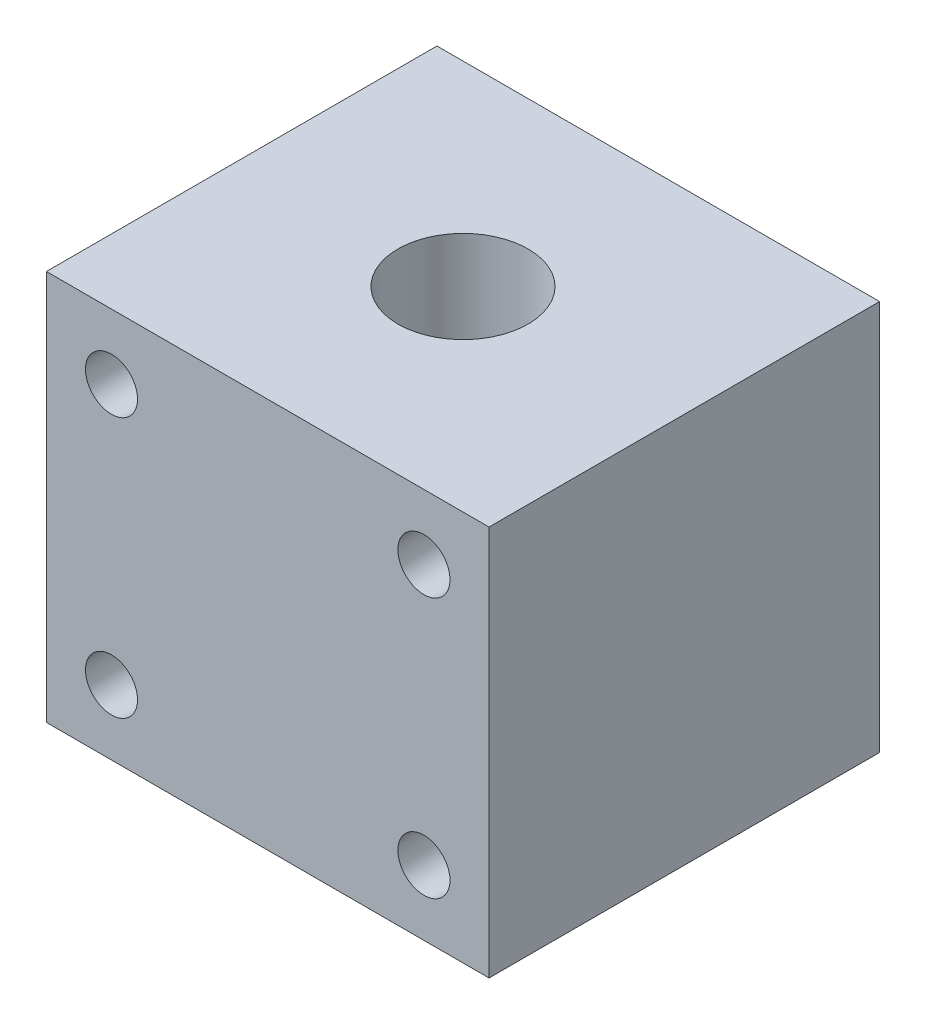
ISO-10303-21;
HEADER;
FILE_DESCRIPTION(('STEP AP214'),'2;1');
FILE_NAME('part.step','',(''),(''),'','','');
FILE_SCHEMA(('AUTOMOTIVE_DESIGN { 1 0 10303 214 1 1 1 1 }'));
ENDSEC;
DATA;
#1=APPLICATION_CONTEXT('core data for automotive mechanical design processes');
#2=APPLICATION_PROTOCOL_DEFINITION('international standard','automotive_design',2000,#1);
#3=PRODUCT_CONTEXT('',#1,'mechanical');
#4=PRODUCT('Part','Part','',(#3));
#5=PRODUCT_RELATED_PRODUCT_CATEGORY('part','',(#4));
#6=PRODUCT_DEFINITION_FORMATION('','',#4);
#7=PRODUCT_DEFINITION_CONTEXT('part definition',#1,'design');
#8=PRODUCT_DEFINITION('design','',#6,#7);
#9=PRODUCT_DEFINITION_SHAPE('','',#8);
#10=(LENGTH_UNIT() NAMED_UNIT(*) SI_UNIT(.MILLI.,.METRE.));
#11=(NAMED_UNIT(*) PLANE_ANGLE_UNIT() SI_UNIT($,.RADIAN.));
#12=(NAMED_UNIT(*) SI_UNIT($,.STERADIAN.) SOLID_ANGLE_UNIT());
#13=UNCERTAINTY_MEASURE_WITH_UNIT(LENGTH_MEASURE(1.E-05),#10,'distance_accuracy_value','');
#14=(GEOMETRIC_REPRESENTATION_CONTEXT(3) GLOBAL_UNCERTAINTY_ASSIGNED_CONTEXT((#13)) GLOBAL_UNIT_ASSIGNED_CONTEXT((#10,
#11,#12)) REPRESENTATION_CONTEXT('',''));
#15=CARTESIAN_POINT('',(0.,0.,0.));
#16=DIRECTION('',(0.,0.,1.));
#17=DIRECTION('',(1.,0.,0.));
#18=AXIS2_PLACEMENT_3D('',#15,#16,#17);
#19=CARTESIAN_POINT('',(0.,30.,0.));
#20=DIRECTION('',(0.,1.,0.));
#21=DIRECTION('',(0.,0.,1.));
#22=AXIS2_PLACEMENT_3D('',#19,#20,#21);
#23=PLANE('',#22);
#24=DIRECTION('',(0.,0.,1.));
#25=VECTOR('',#24,1.);
#26=CARTESIAN_POINT('',(0.,30.,0.));
#27=LINE('',#26,#25);
#28=CARTESIAN_POINT('',(0.,30.,0.));
#29=VERTEX_POINT('',#28);
#30=CARTESIAN_POINT('',(0.,30.,30.));
#31=VERTEX_POINT('',#30);
#32=EDGE_CURVE('E98',#29,#31,#27,.T.);
#33=ORIENTED_EDGE('',*,*,#32,.T.);
#34=DIRECTION('',(1.,0.,0.));
#35=VECTOR('',#34,1.);
#36=CARTESIAN_POINT('',(0.,30.,30.));
#37=LINE('',#36,#35);
#38=CARTESIAN_POINT('',(34.,30.,30.));
#39=VERTEX_POINT('',#38);
#40=EDGE_CURVE('E93',#31,#39,#37,.T.);
#41=ORIENTED_EDGE('',*,*,#40,.T.);
#42=DIRECTION('',(0.,0.,-1.));
#43=VECTOR('',#42,1.);
#44=CARTESIAN_POINT('',(34.,30.,0.));
#45=LINE('',#44,#43);
#46=CARTESIAN_POINT('',(34.,30.,0.));
#47=VERTEX_POINT('',#46);
#48=EDGE_CURVE('E96',#39,#47,#45,.T.);
#49=ORIENTED_EDGE('',*,*,#48,.T.);
#50=DIRECTION('',(-1.,0.,0.));
#51=VECTOR('',#50,1.);
#52=CARTESIAN_POINT('',(0.,30.,0.));
#53=LINE('',#52,#51);
#54=EDGE_CURVE('E63',#47,#29,#53,.T.);
#55=ORIENTED_EDGE('',*,*,#54,.T.);
#56=EDGE_LOOP('',(#33,#41,#49,#55));
#57=FACE_BOUND('',#56,.T.);
#58=CARTESIAN_POINT('',(17.,30.,15.));
#59=DIRECTION('',(0.,1.,0.));
#60=DIRECTION('',(0.,0.,1.));
#61=AXIS2_PLACEMENT_3D('',#58,#59,#60);
#62=CIRCLE('',#61,5.);
#63=CARTESIAN_POINT('',(17.,30.,20.));
#64=VERTEX_POINT('',#63);
#65=EDGE_CURVE('E114',#64,#64,#62,.T.);
#66=ORIENTED_EDGE('',*,*,#65,.F.);
#67=EDGE_LOOP('',(#66));
#68=FACE_BOUND('',#67,.T.);
#69=ADVANCED_FACE('F44',(#57,#68),#23,.T.);
#70=CARTESIAN_POINT('',(0.,0.,0.));
#71=DIRECTION('',(0.,1.,0.));
#72=DIRECTION('',(0.,0.,1.));
#73=AXIS2_PLACEMENT_3D('',#70,#71,#72);
#74=PLANE('',#73);
#75=DIRECTION('',(0.,0.,1.));
#76=VECTOR('',#75,1.);
#77=CARTESIAN_POINT('',(0.,0.,0.));
#78=LINE('',#77,#76);
#79=CARTESIAN_POINT('',(0.,0.,0.));
#80=VERTEX_POINT('',#79);
#81=CARTESIAN_POINT('',(0.,0.,30.));
#82=VERTEX_POINT('',#81);
#83=EDGE_CURVE('E111',#80,#82,#78,.T.);
#84=ORIENTED_EDGE('',*,*,#83,.F.);
#85=DIRECTION('',(-1.,0.,0.));
#86=VECTOR('',#85,1.);
#87=CARTESIAN_POINT('',(0.,0.,0.));
#88=LINE('',#87,#86);
#89=CARTESIAN_POINT('',(34.,0.,0.));
#90=VERTEX_POINT('',#89);
#91=EDGE_CURVE('E86',#90,#80,#88,.T.);
#92=ORIENTED_EDGE('',*,*,#91,.F.);
#93=DIRECTION('',(0.,0.,-1.));
#94=VECTOR('',#93,1.);
#95=CARTESIAN_POINT('',(34.,0.,0.));
#96=LINE('',#95,#94);
#97=CARTESIAN_POINT('',(34.,0.,30.));
#98=VERTEX_POINT('',#97);
#99=EDGE_CURVE('E80',#98,#90,#96,.T.);
#100=ORIENTED_EDGE('',*,*,#99,.F.);
#101=DIRECTION('',(1.,0.,0.));
#102=VECTOR('',#101,1.);
#103=CARTESIAN_POINT('',(0.,0.,30.));
#104=LINE('',#103,#102);
#105=EDGE_CURVE('E102',#82,#98,#104,.T.);
#106=ORIENTED_EDGE('',*,*,#105,.F.);
#107=EDGE_LOOP('',(#84,#92,#100,#106));
#108=FACE_BOUND('',#107,.T.);
#109=CARTESIAN_POINT('',(17.,0.,15.));
#110=DIRECTION('',(0.,1.,0.));
#111=DIRECTION('',(0.,0.,1.));
#112=AXIS2_PLACEMENT_3D('',#109,#110,#111);
#113=CIRCLE('',#112,5.);
#114=CARTESIAN_POINT('',(17.,0.,20.));
#115=VERTEX_POINT('',#114);
#116=EDGE_CURVE('E131',#115,#115,#113,.T.);
#117=ORIENTED_EDGE('',*,*,#116,.T.);
#118=EDGE_LOOP('',(#117));
#119=FACE_BOUND('',#118,.T.);
#120=ADVANCED_FACE('F181',(#108,#119),#74,.F.);
#121=CARTESIAN_POINT('',(0.,30.,0.));
#122=DIRECTION('',(1.,0.,0.));
#123=DIRECTION('',(0.,0.,-1.));
#124=AXIS2_PLACEMENT_3D('',#121,#122,#123);
#125=PLANE('',#124);
#126=ORIENTED_EDGE('',*,*,#83,.T.);
#127=DIRECTION('',(0.,-1.,0.));
#128=VECTOR('',#127,1.);
#129=CARTESIAN_POINT('',(0.,30.,30.));
#130=LINE('',#129,#128);
#131=EDGE_CURVE('E13',#31,#82,#130,.T.);
#132=ORIENTED_EDGE('',*,*,#131,.F.);
#133=ORIENTED_EDGE('',*,*,#32,.F.);
#134=DIRECTION('',(0.,-1.,0.));
#135=VECTOR('',#134,1.);
#136=CARTESIAN_POINT('',(0.,30.,0.));
#137=LINE('',#136,#135);
#138=EDGE_CURVE('E107',#29,#80,#137,.T.);
#139=ORIENTED_EDGE('',*,*,#138,.T.);
#140=EDGE_LOOP('',(#126,#132,#133,#139));
#141=FACE_BOUND('',#140,.T.);
#142=ADVANCED_FACE('F46',(#141),#125,.F.);
#143=CARTESIAN_POINT('',(0.,30.,30.));
#144=DIRECTION('',(0.,0.,-1.));
#145=DIRECTION('',(-1.,0.,0.));
#146=AXIS2_PLACEMENT_3D('',#143,#144,#145);
#147=PLANE('',#146);
#148=CARTESIAN_POINT('',(29.,5.,30.));
#149=DIRECTION('',(0.,0.,-1.));
#150=DIRECTION('',(1.,0.,0.));
#151=AXIS2_PLACEMENT_3D('',#148,#149,#150);
#152=CIRCLE('',#151,2.);
#153=CARTESIAN_POINT('',(31.,5.,30.));
#154=VERTEX_POINT('',#153);
#155=EDGE_CURVE('E144',#154,#154,#152,.T.);
#156=ORIENTED_EDGE('',*,*,#155,.T.);
#157=EDGE_LOOP('',(#156));
#158=FACE_BOUND('',#157,.T.);
#159=CARTESIAN_POINT('',(5.,5.,30.));
#160=DIRECTION('',(0.,0.,-1.));
#161=DIRECTION('',(-1.,0.,0.));
#162=AXIS2_PLACEMENT_3D('',#159,#160,#161);
#163=CIRCLE('',#162,2.);
#164=CARTESIAN_POINT('',(3.,5.,30.));
#165=VERTEX_POINT('',#164);
#166=EDGE_CURVE('E147',#165,#165,#163,.T.);
#167=ORIENTED_EDGE('',*,*,#166,.T.);
#168=EDGE_LOOP('',(#167));
#169=FACE_BOUND('',#168,.T.);
#170=CARTESIAN_POINT('',(5.,25.,30.));
#171=DIRECTION('',(0.,0.,-1.));
#172=DIRECTION('',(1.,0.,0.));
#173=AXIS2_PLACEMENT_3D('',#170,#171,#172);
#174=CIRCLE('',#173,2.);
#175=CARTESIAN_POINT('',(7.,25.,30.));
#176=VERTEX_POINT('',#175);
#177=EDGE_CURVE('E143',#176,#176,#174,.T.);
#178=ORIENTED_EDGE('',*,*,#177,.T.);
#179=EDGE_LOOP('',(#178));
#180=FACE_BOUND('',#179,.T.);
#181=CARTESIAN_POINT('',(29.,25.,30.));
#182=DIRECTION('',(0.,0.,-1.));
#183=DIRECTION('',(-1.,0.,0.));
#184=AXIS2_PLACEMENT_3D('',#181,#182,#183);
#185=CIRCLE('',#184,2.00000000000001);
#186=CARTESIAN_POINT('',(27.,25.,30.));
#187=VERTEX_POINT('',#186);
#188=EDGE_CURVE('E124',#187,#187,#185,.T.);
#189=ORIENTED_EDGE('',*,*,#188,.T.);
#190=EDGE_LOOP('',(#189));
#191=FACE_BOUND('',#190,.T.);
#192=ORIENTED_EDGE('',*,*,#105,.T.);
#193=DIRECTION('',(0.,-1.,0.));
#194=VECTOR('',#193,1.);
#195=CARTESIAN_POINT('',(34.,30.,30.));
#196=LINE('',#195,#194);
#197=EDGE_CURVE('E54',#39,#98,#196,.T.);
#198=ORIENTED_EDGE('',*,*,#197,.F.);
#199=ORIENTED_EDGE('',*,*,#40,.F.);
#200=ORIENTED_EDGE('',*,*,#131,.T.);
#201=EDGE_LOOP('',(#192,#198,#199,#200));
#202=FACE_BOUND('',#201,.T.);
#203=ADVANCED_FACE('F101',(#158,#169,#180,#191,#202),#147,.F.);
#204=CARTESIAN_POINT('',(34.,30.,0.));
#205=DIRECTION('',(-1.,0.,0.));
#206=DIRECTION('',(0.,0.,1.));
#207=AXIS2_PLACEMENT_3D('',#204,#205,#206);
#208=PLANE('',#207);
#209=ORIENTED_EDGE('',*,*,#99,.T.);
#210=DIRECTION('',(0.,-1.,0.));
#211=VECTOR('',#210,1.);
#212=CARTESIAN_POINT('',(34.,30.,0.));
#213=LINE('',#212,#211);
#214=EDGE_CURVE('E103',#47,#90,#213,.T.);
#215=ORIENTED_EDGE('',*,*,#214,.F.);
#216=ORIENTED_EDGE('',*,*,#48,.F.);
#217=ORIENTED_EDGE('',*,*,#197,.T.);
#218=EDGE_LOOP('',(#209,#215,#216,#217));
#219=FACE_BOUND('',#218,.T.);
#220=ADVANCED_FACE('F105',(#219),#208,.F.);
#221=CARTESIAN_POINT('',(0.,30.,0.));
#222=DIRECTION('',(0.,0.,1.));
#223=DIRECTION('',(1.,0.,0.));
#224=AXIS2_PLACEMENT_3D('',#221,#222,#223);
#225=PLANE('',#224);
#226=CARTESIAN_POINT('',(29.,5.,0.));
#227=DIRECTION('',(0.,0.,1.));
#228=DIRECTION('',(1.,0.,0.));
#229=AXIS2_PLACEMENT_3D('',#226,#227,#228);
#230=CIRCLE('',#229,2.);
#231=CARTESIAN_POINT('',(31.,5.,0.));
#232=VERTEX_POINT('',#231);
#233=EDGE_CURVE('E48',#232,#232,#230,.T.);
#234=ORIENTED_EDGE('',*,*,#233,.T.);
#235=EDGE_LOOP('',(#234));
#236=FACE_BOUND('',#235,.T.);
#237=CARTESIAN_POINT('',(5.,5.,0.));
#238=DIRECTION('',(0.,0.,1.));
#239=DIRECTION('',(1.,0.,0.));
#240=AXIS2_PLACEMENT_3D('',#237,#238,#239);
#241=CIRCLE('',#240,2.);
#242=CARTESIAN_POINT('',(7.,5.,0.));
#243=VERTEX_POINT('',#242);
#244=EDGE_CURVE('E126',#243,#243,#241,.T.);
#245=ORIENTED_EDGE('',*,*,#244,.T.);
#246=EDGE_LOOP('',(#245));
#247=FACE_BOUND('',#246,.T.);
#248=CARTESIAN_POINT('',(5.,25.,0.));
#249=DIRECTION('',(0.,0.,1.));
#250=DIRECTION('',(1.,0.,0.));
#251=AXIS2_PLACEMENT_3D('',#248,#249,#250);
#252=CIRCLE('',#251,2.);
#253=CARTESIAN_POINT('',(7.,25.,0.));
#254=VERTEX_POINT('',#253);
#255=EDGE_CURVE('E123',#254,#254,#252,.T.);
#256=ORIENTED_EDGE('',*,*,#255,.T.);
#257=EDGE_LOOP('',(#256));
#258=FACE_BOUND('',#257,.T.);
#259=CARTESIAN_POINT('',(29.,25.,0.));
#260=DIRECTION('',(0.,0.,1.));
#261=DIRECTION('',(1.,0.,0.));
#262=AXIS2_PLACEMENT_3D('',#259,#260,#261);
#263=CIRCLE('',#262,2.00000000000001);
#264=CARTESIAN_POINT('',(31.,25.,0.));
#265=VERTEX_POINT('',#264);
#266=EDGE_CURVE('E120',#265,#265,#263,.T.);
#267=ORIENTED_EDGE('',*,*,#266,.T.);
#268=EDGE_LOOP('',(#267));
#269=FACE_BOUND('',#268,.T.);
#270=ORIENTED_EDGE('',*,*,#91,.T.);
#271=ORIENTED_EDGE('',*,*,#138,.F.);
#272=ORIENTED_EDGE('',*,*,#54,.F.);
#273=ORIENTED_EDGE('',*,*,#214,.T.);
#274=EDGE_LOOP('',(#270,#271,#272,#273));
#275=FACE_BOUND('',#274,.T.);
#276=ADVANCED_FACE('F163',(#236,#247,#258,#269,#275),#225,.F.);
#277=CARTESIAN_POINT('',(17.,30.,15.));
#278=DIRECTION('',(0.,-1.,0.));
#279=DIRECTION('',(0.,0.,-1.));
#280=AXIS2_PLACEMENT_3D('',#277,#278,#279);
#281=CYLINDRICAL_SURFACE('',#280,5.);
#282=ORIENTED_EDGE('',*,*,#65,.T.);
#283=EDGE_LOOP('',(#282));
#284=FACE_BOUND('',#283,.T.);
#285=ORIENTED_EDGE('',*,*,#116,.F.);
#286=EDGE_LOOP('',(#285));
#287=FACE_BOUND('',#286,.T.);
#288=ADVANCED_FACE('F166',(#284,#287),#281,.F.);
#289=CARTESIAN_POINT('',(29.,25.,30.));
#290=DIRECTION('',(0.,0.,-1.));
#291=DIRECTION('',(-1.,0.,0.));
#292=AXIS2_PLACEMENT_3D('',#289,#290,#291);
#293=CYLINDRICAL_SURFACE('',#292,2.00000000000001);
#294=ORIENTED_EDGE('',*,*,#188,.F.);
#295=EDGE_LOOP('',(#294));
#296=FACE_BOUND('',#295,.T.);
#297=ORIENTED_EDGE('',*,*,#266,.F.);
#298=EDGE_LOOP('',(#297));
#299=FACE_BOUND('',#298,.T.);
#300=ADVANCED_FACE('F159',(#296,#299),#293,.F.);
#301=CARTESIAN_POINT('',(5.,25.,30.));
#302=DIRECTION('',(0.,0.,-1.));
#303=DIRECTION('',(-1.,0.,0.));
#304=AXIS2_PLACEMENT_3D('',#301,#302,#303);
#305=CYLINDRICAL_SURFACE('',#304,2.);
#306=ORIENTED_EDGE('',*,*,#177,.F.);
#307=EDGE_LOOP('',(#306));
#308=FACE_BOUND('',#307,.T.);
#309=ORIENTED_EDGE('',*,*,#255,.F.);
#310=EDGE_LOOP('',(#309));
#311=FACE_BOUND('',#310,.T.);
#312=ADVANCED_FACE('F155',(#308,#311),#305,.F.);
#313=CARTESIAN_POINT('',(5.,5.,30.));
#314=DIRECTION('',(0.,0.,-1.));
#315=DIRECTION('',(-1.,0.,0.));
#316=AXIS2_PLACEMENT_3D('',#313,#314,#315);
#317=CYLINDRICAL_SURFACE('',#316,2.);
#318=ORIENTED_EDGE('',*,*,#166,.F.);
#319=EDGE_LOOP('',(#318));
#320=FACE_BOUND('',#319,.T.);
#321=ORIENTED_EDGE('',*,*,#244,.F.);
#322=EDGE_LOOP('',(#321));
#323=FACE_BOUND('',#322,.T.);
#324=ADVANCED_FACE('F158',(#320,#323),#317,.F.);
#325=CARTESIAN_POINT('',(29.,5.,30.));
#326=DIRECTION('',(0.,0.,-1.));
#327=DIRECTION('',(-1.,0.,0.));
#328=AXIS2_PLACEMENT_3D('',#325,#326,#327);
#329=CYLINDRICAL_SURFACE('',#328,2.);
#330=ORIENTED_EDGE('',*,*,#155,.F.);
#331=EDGE_LOOP('',(#330));
#332=FACE_BOUND('',#331,.T.);
#333=ORIENTED_EDGE('',*,*,#233,.F.);
#334=EDGE_LOOP('',(#333));
#335=FACE_BOUND('',#334,.T.);
#336=ADVANCED_FACE('F202',(#332,#335),#329,.F.);
#337=CLOSED_SHELL('',(#69,#120,#142,#203,#220,#276,#288,#300,#312,#324,#336));
#338=MANIFOLD_SOLID_BREP('B2',#337);
#339=ADVANCED_BREP_SHAPE_REPRESENTATION('',(#18,#338),#14);
#340=SHAPE_DEFINITION_REPRESENTATION(#9,#339);
ENDSEC;
END-ISO-10303-21;
